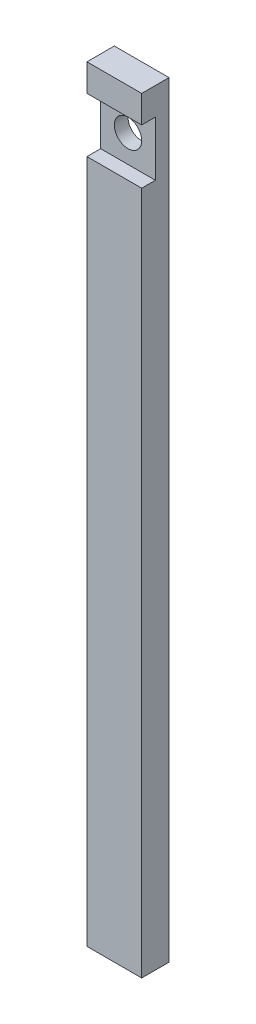
ISO-10303-21;
HEADER;
FILE_DESCRIPTION(('STEP AP214'),'2;1');
FILE_NAME('part.step','',(''),(''),'','','');
FILE_SCHEMA(('AUTOMOTIVE_DESIGN { 1 0 10303 214 1 1 1 1 }'));
ENDSEC;
DATA;
#1=APPLICATION_CONTEXT('core data for automotive mechanical design processes');
#2=APPLICATION_PROTOCOL_DEFINITION('international standard','automotive_design',2000,#1);
#3=PRODUCT_CONTEXT('',#1,'mechanical');
#4=PRODUCT('Part','Part','',(#3));
#5=PRODUCT_RELATED_PRODUCT_CATEGORY('part','',(#4));
#6=PRODUCT_DEFINITION_FORMATION('','',#4);
#7=PRODUCT_DEFINITION_CONTEXT('part definition',#1,'design');
#8=PRODUCT_DEFINITION('design','',#6,#7);
#9=PRODUCT_DEFINITION_SHAPE('','',#8);
#10=(LENGTH_UNIT() NAMED_UNIT(*) SI_UNIT(.MILLI.,.METRE.));
#11=(NAMED_UNIT(*) PLANE_ANGLE_UNIT() SI_UNIT($,.RADIAN.));
#12=(NAMED_UNIT(*) SI_UNIT($,.STERADIAN.) SOLID_ANGLE_UNIT());
#13=UNCERTAINTY_MEASURE_WITH_UNIT(LENGTH_MEASURE(1.E-05),#10,'distance_accuracy_value','');
#14=(GEOMETRIC_REPRESENTATION_CONTEXT(3) GLOBAL_UNCERTAINTY_ASSIGNED_CONTEXT((#13)) GLOBAL_UNIT_ASSIGNED_CONTEXT((#10,
#11,#12)) REPRESENTATION_CONTEXT('',''));
#15=CARTESIAN_POINT('',(0.,0.,0.));
#16=DIRECTION('',(0.,0.,1.));
#17=DIRECTION('',(1.,0.,0.));
#18=AXIS2_PLACEMENT_3D('',#15,#16,#17);
#19=CARTESIAN_POINT('',(0.,355.6,0.));
#20=DIRECTION('',(0.,0.,-1.));
#21=DIRECTION('',(-1.,0.,0.));
#22=AXIS2_PLACEMENT_3D('',#19,#20,#21);
#23=PLANE('',#22);
#24=DIRECTION('',(1.,0.,0.));
#25=VECTOR('',#24,1.);
#26=CARTESIAN_POINT('',(0.,317.5,0.));
#27=LINE('',#26,#25);
#28=CARTESIAN_POINT('',(0.,317.5,0.));
#29=VERTEX_POINT('',#28);
#30=CARTESIAN_POINT('',(25.4,317.5,0.));
#31=VERTEX_POINT('',#30);
#32=EDGE_CURVE('E111',#29,#31,#27,.T.);
#33=ORIENTED_EDGE('',*,*,#32,.F.);
#34=DIRECTION('',(0.,-1.,0.));
#35=VECTOR('',#34,1.);
#36=CARTESIAN_POINT('',(0.,355.6,0.));
#37=LINE('',#36,#35);
#38=CARTESIAN_POINT('',(0.,0.,0.));
#39=VERTEX_POINT('',#38);
#40=EDGE_CURVE('E50',#29,#39,#37,.T.);
#41=ORIENTED_EDGE('',*,*,#40,.T.);
#42=DIRECTION('',(1.,0.,0.));
#43=VECTOR('',#42,1.);
#44=CARTESIAN_POINT('',(0.,0.,0.));
#45=LINE('',#44,#43);
#46=CARTESIAN_POINT('',(25.4,0.,0.));
#47=VERTEX_POINT('',#46);
#48=EDGE_CURVE('E150',#39,#47,#45,.T.);
#49=ORIENTED_EDGE('',*,*,#48,.T.);
#50=DIRECTION('',(0.,-1.,0.));
#51=VECTOR('',#50,1.);
#52=CARTESIAN_POINT('',(25.4,355.6,0.));
#53=LINE('',#52,#51);
#54=EDGE_CURVE('E130',#31,#47,#53,.T.);
#55=ORIENTED_EDGE('',*,*,#54,.F.);
#56=EDGE_LOOP('',(#33,#41,#49,#55));
#57=FACE_BOUND('',#56,.T.);
#58=ADVANCED_FACE('F39',(#57),#23,.F.);
#59=CARTESIAN_POINT('',(25.4,355.6,0.));
#60=DIRECTION('',(-1.,0.,0.));
#61=DIRECTION('',(0.,0.,1.));
#62=AXIS2_PLACEMENT_3D('',#59,#60,#61);
#63=PLANE('',#62);
#64=DIRECTION('',(0.,0.,-1.));
#65=VECTOR('',#64,1.);
#66=CARTESIAN_POINT('',(25.4,317.5,0.));
#67=LINE('',#66,#65);
#68=CARTESIAN_POINT('',(25.4,317.5,-6.35));
#69=VERTEX_POINT('',#68);
#70=EDGE_CURVE('E53',#31,#69,#67,.T.);
#71=ORIENTED_EDGE('',*,*,#70,.F.);
#72=ORIENTED_EDGE('',*,*,#54,.T.);
#73=DIRECTION('',(0.,0.,-1.));
#74=VECTOR('',#73,1.);
#75=CARTESIAN_POINT('',(25.4,0.,0.));
#76=LINE('',#75,#74);
#77=CARTESIAN_POINT('',(25.4,0.,-12.7));
#78=VERTEX_POINT('',#77);
#79=EDGE_CURVE('E144',#47,#78,#76,.T.);
#80=ORIENTED_EDGE('',*,*,#79,.T.);
#81=DIRECTION('',(0.,-1.,0.));
#82=VECTOR('',#81,1.);
#83=CARTESIAN_POINT('',(25.4,355.6,-12.7));
#84=LINE('',#83,#82);
#85=CARTESIAN_POINT('',(25.4,355.6,-12.7));
#86=VERTEX_POINT('',#85);
#87=EDGE_CURVE('E140',#86,#78,#84,.T.);
#88=ORIENTED_EDGE('',*,*,#87,.F.);
#89=DIRECTION('',(0.,0.,-1.));
#90=VECTOR('',#89,1.);
#91=CARTESIAN_POINT('',(25.4,355.6,0.));
#92=LINE('',#91,#90);
#93=CARTESIAN_POINT('',(25.4,355.6,0.));
#94=VERTEX_POINT('',#93);
#95=EDGE_CURVE('E155',#94,#86,#92,.T.);
#96=ORIENTED_EDGE('',*,*,#95,.F.);
#97=CARTESIAN_POINT('',(25.4,342.9,0.));
#98=VERTEX_POINT('',#97);
#99=EDGE_CURVE('E135',#94,#98,#53,.T.);
#100=ORIENTED_EDGE('',*,*,#99,.T.);
#101=DIRECTION('',(0.,0.,1.));
#102=VECTOR('',#101,1.);
#103=CARTESIAN_POINT('',(25.4,342.9,0.));
#104=LINE('',#103,#102);
#105=CARTESIAN_POINT('',(25.4,342.9,-6.35));
#106=VERTEX_POINT('',#105);
#107=EDGE_CURVE('E122',#106,#98,#104,.T.);
#108=ORIENTED_EDGE('',*,*,#107,.F.);
#109=DIRECTION('',(0.,1.,0.));
#110=VECTOR('',#109,1.);
#111=CARTESIAN_POINT('',(25.4,342.9,-6.35));
#112=LINE('',#111,#110);
#113=EDGE_CURVE('E165',#69,#106,#112,.T.);
#114=ORIENTED_EDGE('',*,*,#113,.F.);
#115=EDGE_LOOP('',(#71,#72,#80,#88,#96,#100,#108,#114));
#116=FACE_BOUND('',#115,.T.);
#117=ADVANCED_FACE('F192',(#116),#63,.F.);
#118=CARTESIAN_POINT('',(0.,355.6,0.));
#119=DIRECTION('',(1.,0.,0.));
#120=DIRECTION('',(0.,0.,-1.));
#121=AXIS2_PLACEMENT_3D('',#118,#119,#120);
#122=PLANE('',#121);
#123=DIRECTION('',(0.,1.,0.));
#124=VECTOR('',#123,1.);
#125=CARTESIAN_POINT('',(0.,342.9,-6.35));
#126=LINE('',#125,#124);
#127=CARTESIAN_POINT('',(0.,317.5,-6.35));
#128=VERTEX_POINT('',#127);
#129=CARTESIAN_POINT('',(0.,342.9,-6.35));
#130=VERTEX_POINT('',#129);
#131=EDGE_CURVE('E117',#128,#130,#126,.T.);
#132=ORIENTED_EDGE('',*,*,#131,.T.);
#133=DIRECTION('',(0.,0.,1.));
#134=VECTOR('',#133,1.);
#135=CARTESIAN_POINT('',(0.,342.9,0.));
#136=LINE('',#135,#134);
#137=CARTESIAN_POINT('',(0.,342.9,0.));
#138=VERTEX_POINT('',#137);
#139=EDGE_CURVE('E126',#130,#138,#136,.T.);
#140=ORIENTED_EDGE('',*,*,#139,.T.);
#141=CARTESIAN_POINT('',(0.,355.6,0.));
#142=VERTEX_POINT('',#141);
#143=EDGE_CURVE('E11',#142,#138,#37,.T.);
#144=ORIENTED_EDGE('',*,*,#143,.F.);
#145=DIRECTION('',(0.,0.,1.));
#146=VECTOR('',#145,1.);
#147=CARTESIAN_POINT('',(0.,355.6,0.));
#148=LINE('',#147,#146);
#149=CARTESIAN_POINT('',(0.,355.6,-12.7));
#150=VERTEX_POINT('',#149);
#151=EDGE_CURVE('E145',#150,#142,#148,.T.);
#152=ORIENTED_EDGE('',*,*,#151,.F.);
#153=DIRECTION('',(0.,-1.,0.));
#154=VECTOR('',#153,1.);
#155=CARTESIAN_POINT('',(0.,355.6,-12.7));
#156=LINE('',#155,#154);
#157=CARTESIAN_POINT('',(0.,0.,-12.7));
#158=VERTEX_POINT('',#157);
#159=EDGE_CURVE('E143',#150,#158,#156,.T.);
#160=ORIENTED_EDGE('',*,*,#159,.T.);
#161=DIRECTION('',(0.,0.,1.));
#162=VECTOR('',#161,1.);
#163=CARTESIAN_POINT('',(0.,0.,0.));
#164=LINE('',#163,#162);
#165=EDGE_CURVE('E131',#158,#39,#164,.T.);
#166=ORIENTED_EDGE('',*,*,#165,.T.);
#167=ORIENTED_EDGE('',*,*,#40,.F.);
#168=DIRECTION('',(0.,0.,-1.));
#169=VECTOR('',#168,1.);
#170=CARTESIAN_POINT('',(0.,317.5,0.));
#171=LINE('',#170,#169);
#172=EDGE_CURVE('E112',#29,#128,#171,.T.);
#173=ORIENTED_EDGE('',*,*,#172,.T.);
#174=EDGE_LOOP('',(#132,#140,#144,#152,#160,#166,#167,#173));
#175=FACE_BOUND('',#174,.T.);
#176=ADVANCED_FACE('F41',(#175),#122,.F.);
#177=ORIENTED_EDGE('',*,*,#143,.T.);
#178=DIRECTION('',(1.,0.,0.));
#179=VECTOR('',#178,1.);
#180=CARTESIAN_POINT('',(0.,342.9,0.));
#181=LINE('',#180,#179);
#182=EDGE_CURVE('E147',#138,#98,#181,.T.);
#183=ORIENTED_EDGE('',*,*,#182,.T.);
#184=ORIENTED_EDGE('',*,*,#99,.F.);
#185=DIRECTION('',(1.,0.,0.));
#186=VECTOR('',#185,1.);
#187=CARTESIAN_POINT('',(0.,355.6,0.));
#188=LINE('',#187,#186);
#189=EDGE_CURVE('E93',#142,#94,#188,.T.);
#190=ORIENTED_EDGE('',*,*,#189,.F.);
#191=EDGE_LOOP('',(#177,#183,#184,#190));
#192=FACE_BOUND('',#191,.T.);
#193=ADVANCED_FACE('F195',(#192),#23,.F.);
#194=CARTESIAN_POINT('',(0.,355.6,-12.7));
#195=DIRECTION('',(0.,0.,1.));
#196=DIRECTION('',(1.,0.,0.));
#197=AXIS2_PLACEMENT_3D('',#194,#195,#196);
#198=PLANE('',#197);
#199=CARTESIAN_POINT('',(12.7,330.2,-12.7));
#200=DIRECTION('',(0.,0.,1.));
#201=DIRECTION('',(1.,0.,0.));
#202=AXIS2_PLACEMENT_3D('',#199,#200,#201);
#203=CIRCLE('',#202,6.35);
#204=CARTESIAN_POINT('',(19.05,330.2,-12.7));
#205=VERTEX_POINT('',#204);
#206=EDGE_CURVE('E167',#205,#205,#203,.T.);
#207=ORIENTED_EDGE('',*,*,#206,.T.);
#208=EDGE_LOOP('',(#207));
#209=FACE_BOUND('',#208,.T.);
#210=DIRECTION('',(-1.,0.,0.));
#211=VECTOR('',#210,1.);
#212=CARTESIAN_POINT('',(0.,0.,-12.7));
#213=LINE('',#212,#211);
#214=EDGE_CURVE('E81',#78,#158,#213,.T.);
#215=ORIENTED_EDGE('',*,*,#214,.T.);
#216=ORIENTED_EDGE('',*,*,#159,.F.);
#217=DIRECTION('',(-1.,0.,0.));
#218=VECTOR('',#217,1.);
#219=CARTESIAN_POINT('',(0.,355.6,-12.7));
#220=LINE('',#219,#218);
#221=EDGE_CURVE('E65',#86,#150,#220,.T.);
#222=ORIENTED_EDGE('',*,*,#221,.F.);
#223=ORIENTED_EDGE('',*,*,#87,.T.);
#224=EDGE_LOOP('',(#215,#216,#222,#223));
#225=FACE_BOUND('',#224,.T.);
#226=ADVANCED_FACE('F177',(#209,#225),#198,.F.);
#227=CARTESIAN_POINT('',(0.,355.6,0.));
#228=DIRECTION('',(0.,-1.,0.));
#229=DIRECTION('',(0.,0.,-1.));
#230=AXIS2_PLACEMENT_3D('',#227,#228,#229);
#231=PLANE('',#230);
#232=ORIENTED_EDGE('',*,*,#151,.T.);
#233=ORIENTED_EDGE('',*,*,#189,.T.);
#234=ORIENTED_EDGE('',*,*,#95,.T.);
#235=ORIENTED_EDGE('',*,*,#221,.T.);
#236=EDGE_LOOP('',(#232,#233,#234,#235));
#237=FACE_BOUND('',#236,.T.);
#238=ADVANCED_FACE('F198',(#237),#231,.F.);
#239=CARTESIAN_POINT('',(0.,0.,0.));
#240=DIRECTION('',(0.,-1.,0.));
#241=DIRECTION('',(0.,0.,-1.));
#242=AXIS2_PLACEMENT_3D('',#239,#240,#241);
#243=PLANE('',#242);
#244=ORIENTED_EDGE('',*,*,#165,.F.);
#245=ORIENTED_EDGE('',*,*,#214,.F.);
#246=ORIENTED_EDGE('',*,*,#79,.F.);
#247=ORIENTED_EDGE('',*,*,#48,.F.);
#248=EDGE_LOOP('',(#244,#245,#246,#247));
#249=FACE_BOUND('',#248,.T.);
#250=ADVANCED_FACE('F202',(#249),#243,.T.);
#251=CARTESIAN_POINT('',(0.,342.9,0.));
#252=DIRECTION('',(0.,1.,0.));
#253=DIRECTION('',(0.,0.,1.));
#254=AXIS2_PLACEMENT_3D('',#251,#252,#253);
#255=PLANE('',#254);
#256=ORIENTED_EDGE('',*,*,#107,.T.);
#257=ORIENTED_EDGE('',*,*,#182,.F.);
#258=ORIENTED_EDGE('',*,*,#139,.F.);
#259=DIRECTION('',(1.,0.,0.));
#260=VECTOR('',#259,1.);
#261=CARTESIAN_POINT('',(0.,342.9,-6.35));
#262=LINE('',#261,#260);
#263=EDGE_CURVE('E160',#130,#106,#262,.T.);
#264=ORIENTED_EDGE('',*,*,#263,.T.);
#265=EDGE_LOOP('',(#256,#257,#258,#264));
#266=FACE_BOUND('',#265,.T.);
#267=ADVANCED_FACE('F186',(#266),#255,.F.);
#268=CARTESIAN_POINT('',(0.,342.9,-6.35));
#269=DIRECTION('',(0.,0.,-1.));
#270=DIRECTION('',(0.,1.,0.));
#271=AXIS2_PLACEMENT_3D('',#268,#269,#270);
#272=PLANE('',#271);
#273=CARTESIAN_POINT('',(12.7,330.2,-6.3500000000001));
#274=DIRECTION('',(0.,0.,1.));
#275=DIRECTION('',(1.,0.,0.));
#276=AXIS2_PLACEMENT_3D('',#273,#274,#275);
#277=CIRCLE('',#276,6.35);
#278=CARTESIAN_POINT('',(19.05,330.2,-6.3500000000001));
#279=VERTEX_POINT('',#278);
#280=EDGE_CURVE('E168',#279,#279,#277,.T.);
#281=ORIENTED_EDGE('',*,*,#280,.F.);
#282=EDGE_LOOP('',(#281));
#283=FACE_BOUND('',#282,.T.);
#284=ORIENTED_EDGE('',*,*,#113,.T.);
#285=ORIENTED_EDGE('',*,*,#263,.F.);
#286=ORIENTED_EDGE('',*,*,#131,.F.);
#287=DIRECTION('',(1.,0.,0.));
#288=VECTOR('',#287,1.);
#289=CARTESIAN_POINT('',(0.,317.5,-6.35));
#290=LINE('',#289,#288);
#291=EDGE_CURVE('E113',#128,#69,#290,.T.);
#292=ORIENTED_EDGE('',*,*,#291,.T.);
#293=EDGE_LOOP('',(#284,#285,#286,#292));
#294=FACE_BOUND('',#293,.T.);
#295=ADVANCED_FACE('F184',(#283,#294),#272,.F.);
#296=CARTESIAN_POINT('',(0.,317.5,0.));
#297=DIRECTION('',(0.,-1.,0.));
#298=DIRECTION('',(0.,0.,-1.));
#299=AXIS2_PLACEMENT_3D('',#296,#297,#298);
#300=PLANE('',#299);
#301=ORIENTED_EDGE('',*,*,#70,.T.);
#302=ORIENTED_EDGE('',*,*,#291,.F.);
#303=ORIENTED_EDGE('',*,*,#172,.F.);
#304=ORIENTED_EDGE('',*,*,#32,.T.);
#305=EDGE_LOOP('',(#301,#302,#303,#304));
#306=FACE_BOUND('',#305,.T.);
#307=ADVANCED_FACE('F114',(#306),#300,.F.);
#308=CARTESIAN_POINT('',(12.7,330.2,-12.7));
#309=DIRECTION('',(0.,0.,1.));
#310=DIRECTION('',(1.,0.,0.));
#311=AXIS2_PLACEMENT_3D('',#308,#309,#310);
#312=CYLINDRICAL_SURFACE('',#311,6.35);
#313=ORIENTED_EDGE('',*,*,#206,.F.);
#314=EDGE_LOOP('',(#313));
#315=FACE_BOUND('',#314,.T.);
#316=ORIENTED_EDGE('',*,*,#280,.T.);
#317=EDGE_LOOP('',(#316));
#318=FACE_BOUND('',#317,.T.);
#319=ADVANCED_FACE('F180',(#315,#318),#312,.F.);
#320=CLOSED_SHELL('',(#58,#117,#176,#193,#226,#238,#250,#267,#295,#307,#319));
#321=MANIFOLD_SOLID_BREP('B2',#320);
#322=ADVANCED_BREP_SHAPE_REPRESENTATION('',(#18,#321),#14);
#323=SHAPE_DEFINITION_REPRESENTATION(#9,#322);
ENDSEC;
END-ISO-10303-21;
